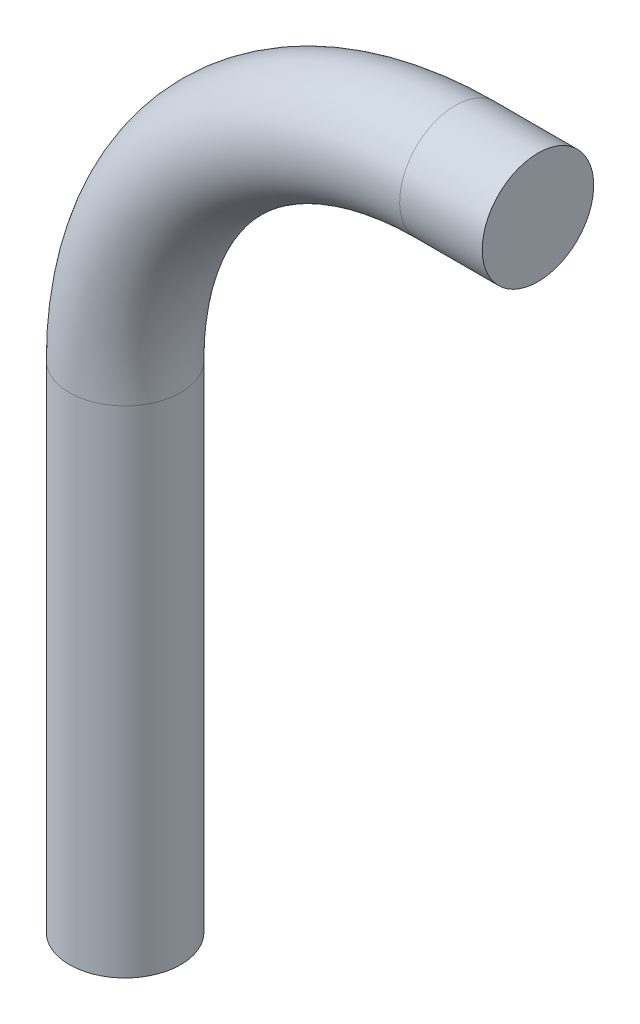
ISO-10303-21;
HEADER;
FILE_DESCRIPTION(('STEP AP214'),'2;1');
FILE_NAME('part.step','',(''),(''),'','','');
FILE_SCHEMA(('AUTOMOTIVE_DESIGN { 1 0 10303 214 1 1 1 1 }'));
ENDSEC;
DATA;
#1=APPLICATION_CONTEXT('core data for automotive mechanical design processes');
#2=APPLICATION_PROTOCOL_DEFINITION('international standard','automotive_design',2000,#1);
#3=PRODUCT_CONTEXT('',#1,'mechanical');
#4=PRODUCT('Part','Part','',(#3));
#5=PRODUCT_RELATED_PRODUCT_CATEGORY('part','',(#4));
#6=PRODUCT_DEFINITION_FORMATION('','',#4);
#7=PRODUCT_DEFINITION_CONTEXT('part definition',#1,'design');
#8=PRODUCT_DEFINITION('design','',#6,#7);
#9=PRODUCT_DEFINITION_SHAPE('','',#8);
#10=(LENGTH_UNIT() NAMED_UNIT(*) SI_UNIT(.MILLI.,.METRE.));
#11=(NAMED_UNIT(*) PLANE_ANGLE_UNIT() SI_UNIT($,.RADIAN.));
#12=(NAMED_UNIT(*) SI_UNIT($,.STERADIAN.) SOLID_ANGLE_UNIT());
#13=UNCERTAINTY_MEASURE_WITH_UNIT(LENGTH_MEASURE(1.E-05),#10,'distance_accuracy_value','');
#14=(GEOMETRIC_REPRESENTATION_CONTEXT(3) GLOBAL_UNCERTAINTY_ASSIGNED_CONTEXT((#13)) GLOBAL_UNIT_ASSIGNED_CONTEXT((#10,
#11,#12)) REPRESENTATION_CONTEXT('',''));
#15=CARTESIAN_POINT('',(0.,0.,0.));
#16=DIRECTION('',(0.,0.,1.));
#17=DIRECTION('',(1.,0.,0.));
#18=AXIS2_PLACEMENT_3D('',#15,#16,#17);
#19=CARTESIAN_POINT('',(0.,0.,0.));
#20=DIRECTION('',(0.,1.,0.));
#21=DIRECTION('',(0.,0.,1.));
#22=AXIS2_PLACEMENT_3D('',#19,#20,#21);
#23=PLANE('',#22);
#24=CARTESIAN_POINT('',(0.,0.,0.));
#25=DIRECTION('',(0.,1.,0.));
#26=DIRECTION('',(0.,0.,1.));
#27=AXIS2_PLACEMENT_3D('',#24,#25,#26);
#28=CIRCLE('',#27,6.75);
#29=CARTESIAN_POINT('',(0.,0.,6.75));
#30=VERTEX_POINT('',#29);
#31=EDGE_CURVE('E42',#30,#30,#28,.T.);
#32=ORIENTED_EDGE('',*,*,#31,.F.);
#33=EDGE_LOOP('',(#32));
#34=FACE_BOUND('',#33,.T.);
#35=ADVANCED_FACE('F30',(#34),#23,.F.);
#36=CARTESIAN_POINT('',(50.,100.,0.));
#37=DIRECTION('',(1.,0.,0.));
#38=DIRECTION('',(0.,0.,1.));
#39=AXIS2_PLACEMENT_3D('',#36,#37,#38);
#40=PLANE('',#39);
#41=CARTESIAN_POINT('',(50.,100.,0.));
#42=DIRECTION('',(1.,0.,0.));
#43=DIRECTION('',(0.,0.,1.));
#44=AXIS2_PLACEMENT_3D('',#41,#42,#43);
#45=CIRCLE('',#44,6.75);
#46=CARTESIAN_POINT('',(50.,100.,6.75));
#47=VERTEX_POINT('',#46);
#48=EDGE_CURVE('E11',#47,#47,#45,.T.);
#49=ORIENTED_EDGE('',*,*,#48,.T.);
#50=EDGE_LOOP('',(#49));
#51=FACE_BOUND('',#50,.T.);
#52=ADVANCED_FACE('F45',(#51),#40,.T.);
#53=CARTESIAN_POINT('',(0.,0.,0.));
#54=DIRECTION('',(0.,1.,0.));
#55=DIRECTION('',(0.,0.,1.));
#56=AXIS2_PLACEMENT_3D('',#53,#54,#55);
#57=CYLINDRICAL_SURFACE('',#56,6.75);
#58=CARTESIAN_POINT('',(0.,59.9999999999997,0.));
#59=DIRECTION('',(0.,1.,0.));
#60=DIRECTION('',(0.,0.,1.));
#61=AXIS2_PLACEMENT_3D('',#58,#59,#60);
#62=CIRCLE('',#61,6.75);
#63=CARTESIAN_POINT('',(-6.75,59.9999999999997,0.));
#64=VERTEX_POINT('',#63);
#65=EDGE_CURVE('E55',#64,#64,#62,.T.);
#66=ORIENTED_EDGE('',*,*,#65,.F.);
#67=EDGE_LOOP('',(#66));
#68=FACE_BOUND('',#67,.T.);
#69=ORIENTED_EDGE('',*,*,#31,.T.);
#70=EDGE_LOOP('',(#69));
#71=FACE_BOUND('',#70,.T.);
#72=ADVANCED_FACE('F60',(#68,#71),#57,.T.);
#73=CARTESIAN_POINT('',(40.,60.,0.));
#74=DIRECTION('',(0.,0.,-1.));
#75=DIRECTION('',(-1.,0.,0.));
#76=AXIS2_PLACEMENT_3D('',#73,#74,#75);
#77=TOROIDAL_SURFACE('',#76,40.,6.75);
#78=CARTESIAN_POINT('',(40.0000000000003,100.,0.));
#79=DIRECTION('',(1.,0.,0.));
#80=DIRECTION('',(0.,0.,1.));
#81=AXIS2_PLACEMENT_3D('',#78,#79,#80);
#82=CIRCLE('',#81,6.75);
#83=CARTESIAN_POINT('',(40.0000000000003,106.75,0.));
#84=VERTEX_POINT('',#83);
#85=EDGE_CURVE('E37',#84,#84,#82,.T.);
#86=CARTESIAN_POINT('',(40.,60.,0.));
#87=DIRECTION('',(0.,0.,-1.));
#88=DIRECTION('',(-1.,0.,0.));
#89=AXIS2_PLACEMENT_3D('',#86,#87,#88);
#90=CIRCLE('',#89,46.75);
#91=EDGE_CURVE('',#64,#84,#90,.T.);
#92=ORIENTED_EDGE('',*,*,#65,.T.);
#93=ORIENTED_EDGE('',*,*,#85,.F.);
#94=ORIENTED_EDGE('',*,*,#91,.T.);
#95=ORIENTED_EDGE('',*,*,#91,.F.);
#96=EDGE_LOOP('',(#92,#94,#93,#95));
#97=FACE_BOUND('',#96,.T.);
#98=ADVANCED_FACE('F50',(#97),#77,.T.);
#99=CARTESIAN_POINT('',(40.0000000000003,100.,0.));
#100=DIRECTION('',(1.,0.,0.));
#101=DIRECTION('',(0.,0.,-1.));
#102=AXIS2_PLACEMENT_3D('',#99,#100,#101);
#103=CYLINDRICAL_SURFACE('',#102,6.75);
#104=ORIENTED_EDGE('',*,*,#48,.F.);
#105=EDGE_LOOP('',(#104));
#106=FACE_BOUND('',#105,.T.);
#107=ORIENTED_EDGE('',*,*,#85,.T.);
#108=EDGE_LOOP('',(#107));
#109=FACE_BOUND('',#108,.T.);
#110=ADVANCED_FACE('F47',(#106,#109),#103,.T.);
#111=CLOSED_SHELL('',(#35,#52,#72,#98,#110));
#112=MANIFOLD_SOLID_BREP('B2',#111);
#113=ADVANCED_BREP_SHAPE_REPRESENTATION('',(#18,#112),#14);
#114=SHAPE_DEFINITION_REPRESENTATION(#9,#113);
ENDSEC;
END-ISO-10303-21;
